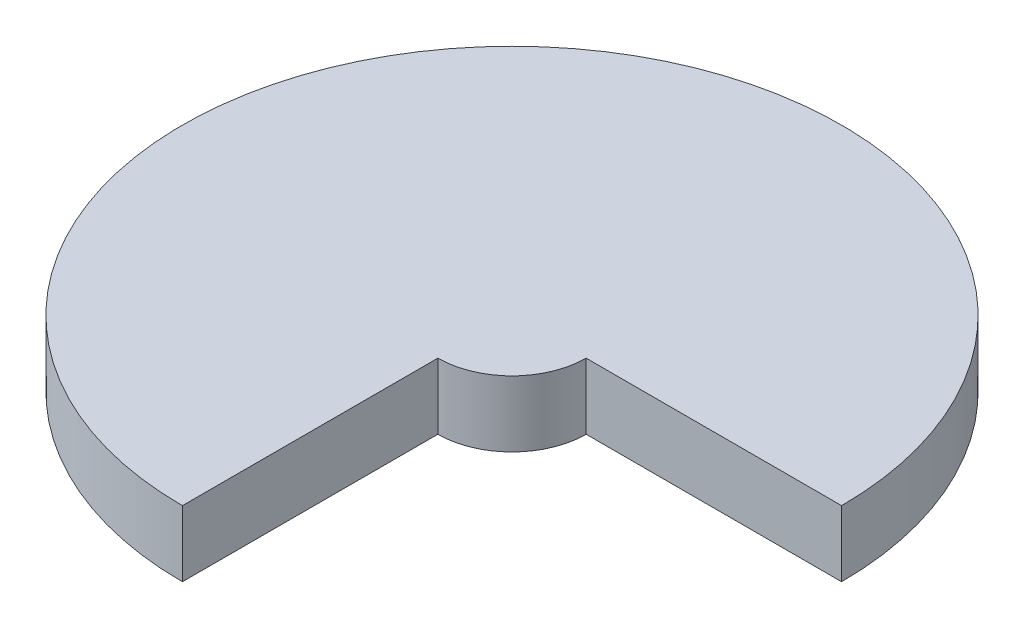
ISO-10303-21;
HEADER;
FILE_DESCRIPTION(('STEP AP214'),'2;1');
FILE_NAME('part.step','',(''),(''),'','','');
FILE_SCHEMA(('AUTOMOTIVE_DESIGN { 1 0 10303 214 1 1 1 1 }'));
ENDSEC;
DATA;
#1=APPLICATION_CONTEXT('core data for automotive mechanical design processes');
#2=APPLICATION_PROTOCOL_DEFINITION('international standard','automotive_design',2000,#1);
#3=PRODUCT_CONTEXT('',#1,'mechanical');
#4=PRODUCT('Part','Part','',(#3));
#5=PRODUCT_RELATED_PRODUCT_CATEGORY('part','',(#4));
#6=PRODUCT_DEFINITION_FORMATION('','',#4);
#7=PRODUCT_DEFINITION_CONTEXT('part definition',#1,'design');
#8=PRODUCT_DEFINITION('design','',#6,#7);
#9=PRODUCT_DEFINITION_SHAPE('','',#8);
#10=(LENGTH_UNIT() NAMED_UNIT(*) SI_UNIT(.MILLI.,.METRE.));
#11=(NAMED_UNIT(*) PLANE_ANGLE_UNIT() SI_UNIT($,.RADIAN.));
#12=(NAMED_UNIT(*) SI_UNIT($,.STERADIAN.) SOLID_ANGLE_UNIT());
#13=UNCERTAINTY_MEASURE_WITH_UNIT(LENGTH_MEASURE(1.E-05),#10,'distance_accuracy_value','');
#14=(GEOMETRIC_REPRESENTATION_CONTEXT(3) GLOBAL_UNCERTAINTY_ASSIGNED_CONTEXT((#13)) GLOBAL_UNIT_ASSIGNED_CONTEXT((#10,
#11,#12)) REPRESENTATION_CONTEXT('',''));
#15=CARTESIAN_POINT('',(0.,0.,0.));
#16=DIRECTION('',(0.,0.,1.));
#17=DIRECTION('',(1.,0.,0.));
#18=AXIS2_PLACEMENT_3D('',#15,#16,#17);
#19=CARTESIAN_POINT('',(0.,20.,0.));
#20=DIRECTION('',(0.,-1.,0.));
#21=DIRECTION('',(0.,0.,-1.));
#22=AXIS2_PLACEMENT_3D('',#19,#20,#21);
#23=CYLINDRICAL_SURFACE('',#22,100.);
#24=CARTESIAN_POINT('',(0.,0.,0.));
#25=DIRECTION('',(0.,1.,0.));
#26=DIRECTION('',(0.,0.,1.));
#27=AXIS2_PLACEMENT_3D('',#24,#25,#26);
#28=CIRCLE('',#27,100.);
#29=CARTESIAN_POINT('',(100.,0.,0.));
#30=VERTEX_POINT('',#29);
#31=CARTESIAN_POINT('',(0.,0.,100.));
#32=VERTEX_POINT('',#31);
#33=EDGE_CURVE('E107',#30,#32,#28,.T.);
#34=ORIENTED_EDGE('',*,*,#33,.T.);
#35=DIRECTION('',(0.,-1.,0.));
#36=VECTOR('',#35,1.);
#37=CARTESIAN_POINT('',(0.,20.,100.));
#38=LINE('',#37,#36);
#39=CARTESIAN_POINT('',(0.,20.,100.));
#40=VERTEX_POINT('',#39);
#41=EDGE_CURVE('E11',#40,#32,#38,.T.);
#42=ORIENTED_EDGE('',*,*,#41,.F.);
#43=CARTESIAN_POINT('',(0.,20.,0.));
#44=DIRECTION('',(0.,1.,0.));
#45=DIRECTION('',(0.,0.,1.));
#46=AXIS2_PLACEMENT_3D('',#43,#44,#45);
#47=CIRCLE('',#46,100.);
#48=CARTESIAN_POINT('',(100.,20.,0.));
#49=VERTEX_POINT('',#48);
#50=EDGE_CURVE('E91',#49,#40,#47,.T.);
#51=ORIENTED_EDGE('',*,*,#50,.F.);
#52=DIRECTION('',(0.,-1.,0.));
#53=VECTOR('',#52,1.);
#54=CARTESIAN_POINT('',(100.,20.,0.));
#55=LINE('',#54,#53);
#56=EDGE_CURVE('E103',#49,#30,#55,.T.);
#57=ORIENTED_EDGE('',*,*,#56,.T.);
#58=EDGE_LOOP('',(#34,#42,#51,#57));
#59=FACE_BOUND('',#58,.T.);
#60=ADVANCED_FACE('F39',(#59),#23,.T.);
#61=CARTESIAN_POINT('',(0.,20.,22.5));
#62=DIRECTION('',(-1.,0.,0.));
#63=DIRECTION('',(0.,0.,1.));
#64=AXIS2_PLACEMENT_3D('',#61,#62,#63);
#65=PLANE('',#64);
#66=DIRECTION('',(0.,0.,-1.));
#67=VECTOR('',#66,1.);
#68=CARTESIAN_POINT('',(0.,0.,22.5));
#69=LINE('',#68,#67);
#70=CARTESIAN_POINT('',(0.,0.,22.5));
#71=VERTEX_POINT('',#70);
#72=EDGE_CURVE('E96',#32,#71,#69,.T.);
#73=ORIENTED_EDGE('',*,*,#72,.T.);
#74=DIRECTION('',(0.,-1.,0.));
#75=VECTOR('',#74,1.);
#76=CARTESIAN_POINT('',(0.,20.,22.5));
#77=LINE('',#76,#75);
#78=CARTESIAN_POINT('',(0.,20.,22.5));
#79=VERTEX_POINT('',#78);
#80=EDGE_CURVE('E48',#79,#71,#77,.T.);
#81=ORIENTED_EDGE('',*,*,#80,.F.);
#82=DIRECTION('',(0.,0.,-1.));
#83=VECTOR('',#82,1.);
#84=CARTESIAN_POINT('',(0.,20.,22.5));
#85=LINE('',#84,#83);
#86=EDGE_CURVE('E86',#40,#79,#85,.T.);
#87=ORIENTED_EDGE('',*,*,#86,.F.);
#88=ORIENTED_EDGE('',*,*,#41,.T.);
#89=EDGE_LOOP('',(#73,#81,#87,#88));
#90=FACE_BOUND('',#89,.T.);
#91=ADVANCED_FACE('F95',(#90),#65,.F.);
#92=CARTESIAN_POINT('',(0.,20.,0.));
#93=DIRECTION('',(0.,-1.,0.));
#94=DIRECTION('',(0.,0.,-1.));
#95=AXIS2_PLACEMENT_3D('',#92,#93,#94);
#96=CYLINDRICAL_SURFACE('',#95,22.5);
#97=CARTESIAN_POINT('',(0.,0.,0.));
#98=DIRECTION('',(0.,1.,0.));
#99=DIRECTION('',(0.,0.,1.));
#100=AXIS2_PLACEMENT_3D('',#97,#98,#99);
#101=CIRCLE('',#100,22.5);
#102=CARTESIAN_POINT('',(22.5,0.,0.));
#103=VERTEX_POINT('',#102);
#104=EDGE_CURVE('E73',#71,#103,#101,.T.);
#105=ORIENTED_EDGE('',*,*,#104,.T.);
#106=DIRECTION('',(0.,-1.,0.));
#107=VECTOR('',#106,1.);
#108=CARTESIAN_POINT('',(22.5,20.,0.));
#109=LINE('',#108,#107);
#110=CARTESIAN_POINT('',(22.5,20.,0.));
#111=VERTEX_POINT('',#110);
#112=EDGE_CURVE('E98',#111,#103,#109,.T.);
#113=ORIENTED_EDGE('',*,*,#112,.F.);
#114=CARTESIAN_POINT('',(0.,20.,0.));
#115=DIRECTION('',(0.,1.,0.));
#116=DIRECTION('',(0.,0.,1.));
#117=AXIS2_PLACEMENT_3D('',#114,#115,#116);
#118=CIRCLE('',#117,22.5);
#119=EDGE_CURVE('E89',#79,#111,#118,.T.);
#120=ORIENTED_EDGE('',*,*,#119,.F.);
#121=ORIENTED_EDGE('',*,*,#80,.T.);
#122=EDGE_LOOP('',(#105,#113,#120,#121));
#123=FACE_BOUND('',#122,.T.);
#124=ADVANCED_FACE('F99',(#123),#96,.T.);
#125=CARTESIAN_POINT('',(100.,20.,0.));
#126=DIRECTION('',(0.,0.,-1.));
#127=DIRECTION('',(-1.,0.,0.));
#128=AXIS2_PLACEMENT_3D('',#125,#126,#127);
#129=PLANE('',#128);
#130=DIRECTION('',(1.,0.,0.));
#131=VECTOR('',#130,1.);
#132=CARTESIAN_POINT('',(100.,0.,0.));
#133=LINE('',#132,#131);
#134=EDGE_CURVE('E79',#103,#30,#133,.T.);
#135=ORIENTED_EDGE('',*,*,#134,.T.);
#136=ORIENTED_EDGE('',*,*,#56,.F.);
#137=DIRECTION('',(1.,0.,0.));
#138=VECTOR('',#137,1.);
#139=CARTESIAN_POINT('',(100.,20.,0.));
#140=LINE('',#139,#138);
#141=EDGE_CURVE('E56',#111,#49,#140,.T.);
#142=ORIENTED_EDGE('',*,*,#141,.F.);
#143=ORIENTED_EDGE('',*,*,#112,.T.);
#144=EDGE_LOOP('',(#135,#136,#142,#143));
#145=FACE_BOUND('',#144,.T.);
#146=ADVANCED_FACE('F120',(#145),#129,.F.);
#147=CARTESIAN_POINT('',(0.,20.,0.));
#148=DIRECTION('',(0.,1.,0.));
#149=DIRECTION('',(0.,0.,1.));
#150=AXIS2_PLACEMENT_3D('',#147,#148,#149);
#151=PLANE('',#150);
#152=ORIENTED_EDGE('',*,*,#50,.T.);
#153=ORIENTED_EDGE('',*,*,#86,.T.);
#154=ORIENTED_EDGE('',*,*,#119,.T.);
#155=ORIENTED_EDGE('',*,*,#141,.T.);
#156=EDGE_LOOP('',(#152,#153,#154,#155));
#157=FACE_BOUND('',#156,.T.);
#158=ADVANCED_FACE('F87',(#157),#151,.T.);
#159=CARTESIAN_POINT('',(0.,0.,0.));
#160=DIRECTION('',(0.,1.,0.));
#161=DIRECTION('',(0.,0.,1.));
#162=AXIS2_PLACEMENT_3D('',#159,#160,#161);
#163=PLANE('',#162);
#164=ORIENTED_EDGE('',*,*,#33,.F.);
#165=ORIENTED_EDGE('',*,*,#134,.F.);
#166=ORIENTED_EDGE('',*,*,#104,.F.);
#167=ORIENTED_EDGE('',*,*,#72,.F.);
#168=EDGE_LOOP('',(#164,#165,#166,#167));
#169=FACE_BOUND('',#168,.T.);
#170=ADVANCED_FACE('F123',(#169),#163,.F.);
#171=CLOSED_SHELL('',(#60,#91,#124,#146,#158,#170));
#172=MANIFOLD_SOLID_BREP('B2',#171);
#173=ADVANCED_BREP_SHAPE_REPRESENTATION('',(#18,#172),#14);
#174=SHAPE_DEFINITION_REPRESENTATION(#9,#173);
ENDSEC;
END-ISO-10303-21;
